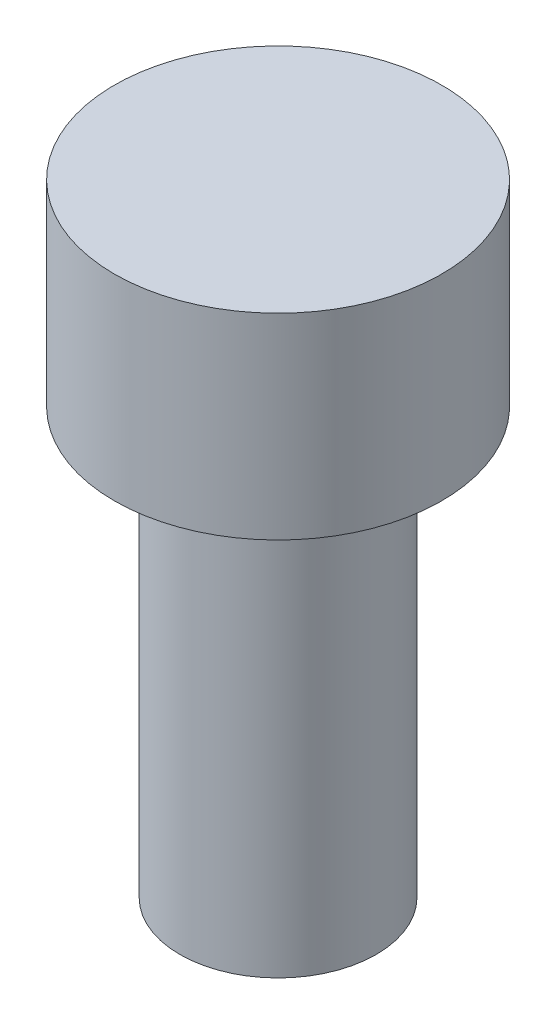
ISO-10303-21;
HEADER;
FILE_DESCRIPTION(('STEP AP214'),'2;1');
FILE_NAME('part.step','',(''),(''),'','','');
FILE_SCHEMA(('AUTOMOTIVE_DESIGN { 1 0 10303 214 1 1 1 1 }'));
ENDSEC;
DATA;
#1=APPLICATION_CONTEXT('core data for automotive mechanical design processes');
#2=APPLICATION_PROTOCOL_DEFINITION('international standard','automotive_design',2000,#1);
#3=PRODUCT_CONTEXT('',#1,'mechanical');
#4=PRODUCT('Part','Part','',(#3));
#5=PRODUCT_RELATED_PRODUCT_CATEGORY('part','',(#4));
#6=PRODUCT_DEFINITION_FORMATION('','',#4);
#7=PRODUCT_DEFINITION_CONTEXT('part definition',#1,'design');
#8=PRODUCT_DEFINITION('design','',#6,#7);
#9=PRODUCT_DEFINITION_SHAPE('','',#8);
#10=(LENGTH_UNIT() NAMED_UNIT(*) SI_UNIT(.MILLI.,.METRE.));
#11=(NAMED_UNIT(*) PLANE_ANGLE_UNIT() SI_UNIT($,.RADIAN.));
#12=(NAMED_UNIT(*) SI_UNIT($,.STERADIAN.) SOLID_ANGLE_UNIT());
#13=UNCERTAINTY_MEASURE_WITH_UNIT(LENGTH_MEASURE(1.E-05),#10,'distance_accuracy_value','');
#14=(GEOMETRIC_REPRESENTATION_CONTEXT(3) GLOBAL_UNCERTAINTY_ASSIGNED_CONTEXT((#13)) GLOBAL_UNIT_ASSIGNED_CONTEXT((#10,
#11,#12)) REPRESENTATION_CONTEXT('',''));
#15=CARTESIAN_POINT('',(0.,0.,0.));
#16=DIRECTION('',(0.,0.,1.));
#17=DIRECTION('',(1.,0.,0.));
#18=AXIS2_PLACEMENT_3D('',#15,#16,#17);
#19=CARTESIAN_POINT('',(0.,13.,0.));
#20=DIRECTION('',(0.,-1.,0.));
#21=DIRECTION('',(0.,0.,-1.));
#22=AXIS2_PLACEMENT_3D('',#19,#20,#21);
#23=CYLINDRICAL_SURFACE('',#22,3.);
#24=CARTESIAN_POINT('',(0.,13.,0.));
#25=DIRECTION('',(0.,1.,0.));
#26=DIRECTION('',(0.,0.,1.));
#27=AXIS2_PLACEMENT_3D('',#24,#25,#26);
#28=CIRCLE('',#27,3.);
#29=CARTESIAN_POINT('',(0.,13.,-3.));
#30=VERTEX_POINT('',#29);
#31=EDGE_CURVE('E10',#30,#30,#28,.T.);
#32=CARTESIAN_POINT('',(0.,0.,0.));
#33=DIRECTION('',(0.,1.,0.));
#34=DIRECTION('',(0.,0.,1.));
#35=AXIS2_PLACEMENT_3D('',#32,#33,#34);
#36=CIRCLE('',#35,3.);
#37=CARTESIAN_POINT('',(0.,0.,-3.));
#38=VERTEX_POINT('',#37);
#39=EDGE_CURVE('E36',#38,#38,#36,.T.);
#40=CARTESIAN_POINT('',(0.,13.,-3.));
#41=CARTESIAN_POINT('',(0.,12.8645833333333,-3.));
#42=CARTESIAN_POINT('',(0.,12.7291666666667,-3.));
#43=CARTESIAN_POINT('',(0.,12.4583333333333,-3.));
#44=CARTESIAN_POINT('',(0.,12.3229166666667,-3.));
#45=CARTESIAN_POINT('',(0.,12.0520833333333,-3.));
#46=CARTESIAN_POINT('',(0.,11.9166666666667,-3.));
#47=CARTESIAN_POINT('',(0.,11.6458333333333,-3.));
#48=CARTESIAN_POINT('',(0.,11.5104166666667,-3.));
#49=CARTESIAN_POINT('',(0.,11.2395833333333,-3.));
#50=CARTESIAN_POINT('',(0.,11.1041666666667,-3.));
#51=CARTESIAN_POINT('',(0.,10.8333333333333,-3.));
#52=CARTESIAN_POINT('',(0.,10.6979166666667,-3.));
#53=CARTESIAN_POINT('',(0.,10.4270833333333,-3.));
#54=CARTESIAN_POINT('',(0.,10.2916666666667,-3.));
#55=CARTESIAN_POINT('',(0.,10.0208333333333,-3.));
#56=CARTESIAN_POINT('',(0.,9.88541666666667,-3.));
#57=CARTESIAN_POINT('',(0.,9.61458333333333,-3.));
#58=CARTESIAN_POINT('',(0.,9.47916666666667,-3.));
#59=CARTESIAN_POINT('',(0.,9.20833333333333,-3.));
#60=CARTESIAN_POINT('',(0.,9.07291666666667,-3.));
#61=CARTESIAN_POINT('',(0.,8.80208333333333,-3.));
#62=CARTESIAN_POINT('',(0.,8.66666666666667,-3.));
#63=CARTESIAN_POINT('',(0.,8.39583333333333,-3.));
#64=CARTESIAN_POINT('',(0.,8.26041666666667,-3.));
#65=CARTESIAN_POINT('',(0.,7.98958333333333,-3.));
#66=CARTESIAN_POINT('',(0.,7.85416666666667,-3.));
#67=CARTESIAN_POINT('',(0.,7.58333333333333,-3.));
#68=CARTESIAN_POINT('',(0.,7.44791666666667,-3.));
#69=CARTESIAN_POINT('',(0.,7.17708333333333,-3.));
#70=CARTESIAN_POINT('',(0.,7.04166666666667,-3.));
#71=CARTESIAN_POINT('',(0.,6.77083333333333,-3.));
#72=CARTESIAN_POINT('',(0.,6.63541666666667,-3.));
#73=CARTESIAN_POINT('',(0.,6.36458333333333,-3.));
#74=CARTESIAN_POINT('',(0.,6.22916666666667,-3.));
#75=CARTESIAN_POINT('',(0.,5.95833333333333,-3.));
#76=CARTESIAN_POINT('',(0.,5.82291666666667,-3.));
#77=CARTESIAN_POINT('',(0.,5.55208333333333,-3.));
#78=CARTESIAN_POINT('',(0.,5.41666666666667,-3.));
#79=CARTESIAN_POINT('',(0.,5.14583333333333,-3.));
#80=CARTESIAN_POINT('',(0.,5.01041666666667,-3.));
#81=CARTESIAN_POINT('',(0.,4.73958333333333,-3.));
#82=CARTESIAN_POINT('',(0.,4.60416666666667,-3.));
#83=CARTESIAN_POINT('',(0.,4.33333333333333,-3.));
#84=CARTESIAN_POINT('',(0.,4.19791666666667,-3.));
#85=CARTESIAN_POINT('',(0.,3.92708333333333,-3.));
#86=CARTESIAN_POINT('',(0.,3.79166666666667,-3.));
#87=CARTESIAN_POINT('',(0.,3.52083333333333,-3.));
#88=CARTESIAN_POINT('',(0.,3.38541666666667,-3.));
#89=CARTESIAN_POINT('',(0.,3.11458333333333,-3.));
#90=CARTESIAN_POINT('',(0.,2.97916666666667,-3.));
#91=CARTESIAN_POINT('',(0.,2.70833333333333,-3.));
#92=CARTESIAN_POINT('',(0.,2.57291666666667,-3.));
#93=CARTESIAN_POINT('',(0.,2.30208333333333,-3.));
#94=CARTESIAN_POINT('',(0.,2.16666666666667,-3.));
#95=CARTESIAN_POINT('',(0.,1.89583333333333,-3.));
#96=CARTESIAN_POINT('',(0.,1.76041666666667,-3.));
#97=CARTESIAN_POINT('',(0.,1.48958333333333,-3.));
#98=CARTESIAN_POINT('',(0.,1.35416666666667,-3.));
#99=CARTESIAN_POINT('',(0.,1.08333333333333,-3.));
#100=CARTESIAN_POINT('',(0.,0.947916666666667,-3.));
#101=CARTESIAN_POINT('',(0.,0.677083333333334,-3.));
#102=CARTESIAN_POINT('',(0.,0.541666666666667,-3.));
#103=CARTESIAN_POINT('',(0.,0.270833333333334,-3.));
#104=CARTESIAN_POINT('',(0.,0.135416666666667,-3.));
#105=CARTESIAN_POINT('',(0.,0.,-3.));
#106=B_SPLINE_CURVE_WITH_KNOTS('',3,(#40,#41,#42,#43,#44,#45,#46,#47,#48,#49,#50,#51,#52,#53,
#54,#55,#56,#57,#58,#59,#60,#61,#62,#63,#64,#65,#66,#67,#68,#69,#70,#71,#72,#73,#74,#75,#76,#77,
#78,#79,#80,#81,#82,#83,#84,#85,#86,#87,#88,#89,#90,#91,#92,#93,#94,#95,#96,#97,#98,#99,#100,
#101,#102,#103,#104,#105),.UNSPECIFIED.,.F.,.F.,(4,2,2,2,2,2,2,2,2,2,2,2,2,2,2,2,2,2,2,2,2,2,2,
2,2,2,2,2,2,2,2,2,4),(0.,0.406249999999999,0.812499999999999,1.21875,1.625,2.03125,2.4375,
2.84375,3.25,3.65625,4.0625,4.46875,4.875,5.28125,5.6875,6.09375,6.5,6.90625,7.3125,7.71875,
8.125,8.53125,8.9375,9.34375,9.75,10.15625,10.5625,10.96875,11.375,11.78125,12.1875,12.59375,
13.),.UNSPECIFIED.);
#107=EDGE_CURVE('BSEAM33',#30,#38,#106,.T.);
#108=ORIENTED_EDGE('',*,*,#31,.F.);
#109=ORIENTED_EDGE('',*,*,#39,.T.);
#110=ORIENTED_EDGE('',*,*,#107,.T.);
#111=ORIENTED_EDGE('',*,*,#107,.F.);
#112=EDGE_LOOP('',(#108,#110,#109,#111));
#113=FACE_BOUND('',#112,.T.);
#114=ADVANCED_FACE('F33',(#113),#23,.T.);
#115=CARTESIAN_POINT('',(0.,0.,0.));
#116=DIRECTION('',(0.,1.,0.));
#117=DIRECTION('',(0.,0.,1.));
#118=AXIS2_PLACEMENT_3D('',#115,#116,#117);
#119=PLANE('',#118);
#120=ORIENTED_EDGE('',*,*,#39,.F.);
#121=EDGE_LOOP('',(#120));
#122=FACE_BOUND('',#121,.T.);
#123=ADVANCED_FACE('F56',(#122),#119,.F.);
#124=CARTESIAN_POINT('',(0.,19.,0.));
#125=DIRECTION('',(0.,-1.,0.));
#126=DIRECTION('',(0.,0.,-1.));
#127=AXIS2_PLACEMENT_3D('',#124,#125,#126);
#128=CYLINDRICAL_SURFACE('',#127,5.);
#129=CARTESIAN_POINT('',(0.,19.,0.));
#130=DIRECTION('',(0.,1.,0.));
#131=DIRECTION('',(0.,0.,1.));
#132=AXIS2_PLACEMENT_3D('',#129,#130,#131);
#133=CIRCLE('',#132,5.);
#134=CARTESIAN_POINT('',(0.,19.,5.));
#135=VERTEX_POINT('',#134);
#136=EDGE_CURVE('E43',#135,#135,#133,.T.);
#137=ORIENTED_EDGE('',*,*,#136,.F.);
#138=EDGE_LOOP('',(#137));
#139=FACE_BOUND('',#138,.T.);
#140=CARTESIAN_POINT('',(0.,13.,0.));
#141=DIRECTION('',(0.,1.,0.));
#142=DIRECTION('',(0.,0.,1.));
#143=AXIS2_PLACEMENT_3D('',#140,#141,#142);
#144=CIRCLE('',#143,5.);
#145=CARTESIAN_POINT('',(0.,13.,5.));
#146=VERTEX_POINT('',#145);
#147=EDGE_CURVE('E45',#146,#146,#144,.T.);
#148=ORIENTED_EDGE('',*,*,#147,.T.);
#149=EDGE_LOOP('',(#148));
#150=FACE_BOUND('',#149,.T.);
#151=ADVANCED_FACE('F53',(#139,#150),#128,.T.);
#152=CARTESIAN_POINT('',(0.,19.,0.));
#153=DIRECTION('',(0.,1.,0.));
#154=DIRECTION('',(0.,0.,1.));
#155=AXIS2_PLACEMENT_3D('',#152,#153,#154);
#156=PLANE('',#155);
#157=ORIENTED_EDGE('',*,*,#136,.T.);
#158=EDGE_LOOP('',(#157));
#159=FACE_BOUND('',#158,.T.);
#160=ADVANCED_FACE('F51',(#159),#156,.T.);
#161=CARTESIAN_POINT('',(0.,13.,0.));
#162=DIRECTION('',(0.,1.,0.));
#163=DIRECTION('',(0.,0.,1.));
#164=AXIS2_PLACEMENT_3D('',#161,#162,#163);
#165=PLANE('',#164);
#166=ORIENTED_EDGE('',*,*,#31,.T.);
#167=EDGE_LOOP('',(#166));
#168=FACE_BOUND('',#167,.T.);
#169=ORIENTED_EDGE('',*,*,#147,.F.);
#170=EDGE_LOOP('',(#169));
#171=FACE_BOUND('',#170,.T.);
#172=ADVANCED_FACE('F60',(#168,#171),#165,.F.);
#173=CLOSED_SHELL('',(#114,#123,#151,#160,#172));
#174=MANIFOLD_SOLID_BREP('B2',#173);
#175=ADVANCED_BREP_SHAPE_REPRESENTATION('',(#18,#174),#14);
#176=SHAPE_DEFINITION_REPRESENTATION(#9,#175);
ENDSEC;
END-ISO-10303-21;
